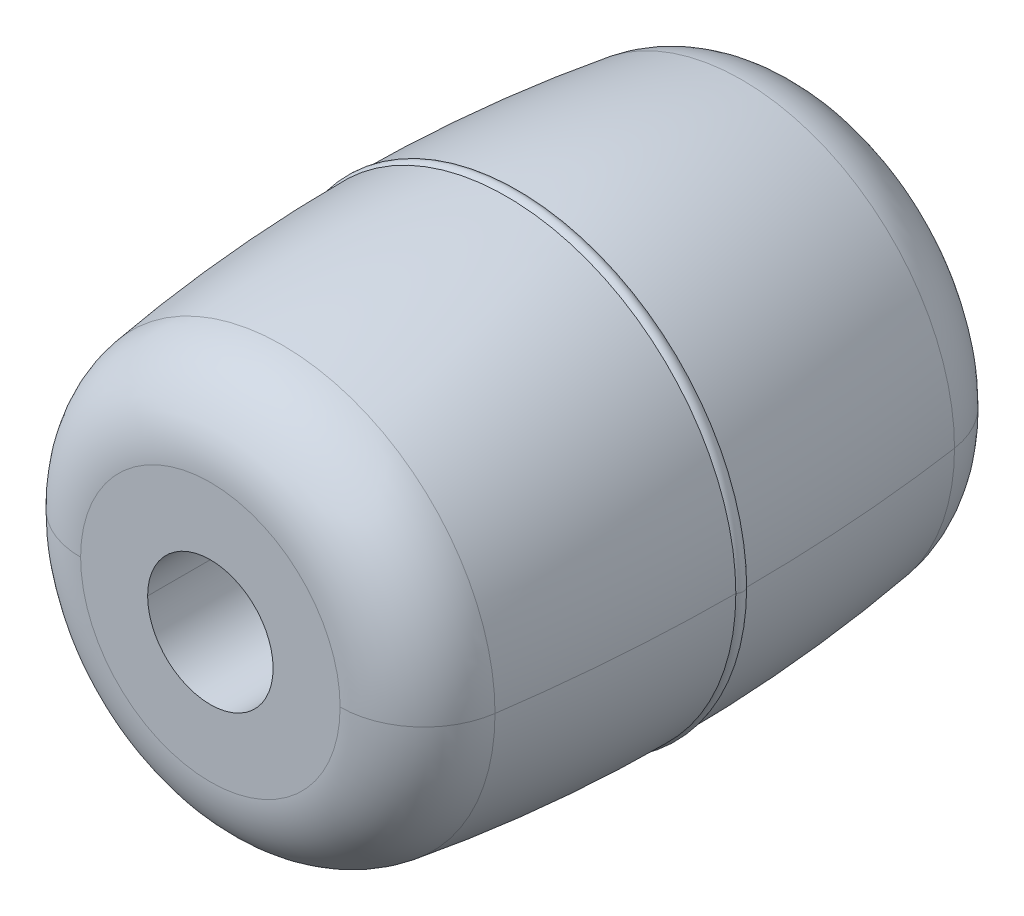
ISO-10303-21;
HEADER;
FILE_DESCRIPTION(('STEP AP214'),'2;1');
FILE_NAME('part.step','',(''),(''),'','','');
FILE_SCHEMA(('AUTOMOTIVE_DESIGN { 1 0 10303 214 1 1 1 1 }'));
ENDSEC;
DATA;
#1=APPLICATION_CONTEXT('core data for automotive mechanical design processes');
#2=APPLICATION_PROTOCOL_DEFINITION('international standard','automotive_design',2000,#1);
#3=PRODUCT_CONTEXT('',#1,'mechanical');
#4=PRODUCT('Part','Part','',(#3));
#5=PRODUCT_RELATED_PRODUCT_CATEGORY('part','',(#4));
#6=PRODUCT_DEFINITION_FORMATION('','',#4);
#7=PRODUCT_DEFINITION_CONTEXT('part definition',#1,'design');
#8=PRODUCT_DEFINITION('design','',#6,#7);
#9=PRODUCT_DEFINITION_SHAPE('','',#8);
#10=(LENGTH_UNIT() NAMED_UNIT(*) SI_UNIT(.MILLI.,.METRE.));
#11=(NAMED_UNIT(*) PLANE_ANGLE_UNIT() SI_UNIT($,.RADIAN.));
#12=(NAMED_UNIT(*) SI_UNIT($,.STERADIAN.) SOLID_ANGLE_UNIT());
#13=UNCERTAINTY_MEASURE_WITH_UNIT(LENGTH_MEASURE(1.E-05),#10,'distance_accuracy_value','');
#14=(GEOMETRIC_REPRESENTATION_CONTEXT(3) GLOBAL_UNCERTAINTY_ASSIGNED_CONTEXT((#13)) GLOBAL_UNIT_ASSIGNED_CONTEXT((#10,
#11,#12)) REPRESENTATION_CONTEXT('',''));
#15=CARTESIAN_POINT('',(0.,0.,0.));
#16=DIRECTION('',(0.,0.,1.));
#17=DIRECTION('',(1.,0.,0.));
#18=AXIS2_PLACEMENT_3D('',#15,#16,#17);
#19=CARTESIAN_POINT('',(0.,0.,0.));
#20=DIRECTION('',(0.,0.,1.));
#21=DIRECTION('',(1.,0.,0.));
#22=AXIS2_PLACEMENT_3D('',#19,#20,#21);
#23=TOROIDAL_SURFACE('',#22,7.04223679300417,0.260263206995828);
#24=CARTESIAN_POINT('',(0.,0.,-0.170686670891901));
#25=DIRECTION('',(0.,0.,-1.));
#26=DIRECTION('',(1.,0.,0.));
#27=AXIS2_PLACEMENT_3D('',#24,#25,#26);
#28=CIRCLE('',#27,7.23871324781646);
#29=CARTESIAN_POINT('',(-7.23871324781646,0.,-0.170686670891901));
#30=VERTEX_POINT('',#29);
#31=CARTESIAN_POINT('',(7.23871324781646,0.,-0.170686670891901));
#32=VERTEX_POINT('',#31);
#33=EDGE_CURVE('E122',#30,#32,#28,.T.);
#34=ORIENTED_EDGE('',*,*,#33,.F.);
#35=CARTESIAN_POINT('',(-7.04223679300417,0.,0.));
#36=DIRECTION('',(0.,1.,0.));
#37=DIRECTION('',(-1.,0.,0.));
#38=AXIS2_PLACEMENT_3D('',#35,#36,#37);
#39=CIRCLE('',#38,0.260263206995828);
#40=CARTESIAN_POINT('',(-7.23871324781646,0.,0.170686670891901));
#41=VERTEX_POINT('',#40);
#42=EDGE_CURVE('E11',#30,#41,#39,.T.);
#43=ORIENTED_EDGE('',*,*,#42,.T.);
#44=CARTESIAN_POINT('',(0.,0.,0.170686670891901));
#45=DIRECTION('',(0.,0.,1.));
#46=DIRECTION('',(-1.,0.,0.));
#47=AXIS2_PLACEMENT_3D('',#44,#45,#46);
#48=CIRCLE('',#47,7.23871324781646);
#49=CARTESIAN_POINT('',(7.23871324781646,0.,0.170686670891901));
#50=VERTEX_POINT('',#49);
#51=EDGE_CURVE('E128',#50,#41,#48,.T.);
#52=ORIENTED_EDGE('',*,*,#51,.F.);
#53=CARTESIAN_POINT('',(7.04223679300417,0.,0.));
#54=DIRECTION('',(0.,-1.,0.));
#55=DIRECTION('',(0.,0.,-1.));
#56=AXIS2_PLACEMENT_3D('',#53,#54,#55);
#57=CIRCLE('',#56,0.260263206995828);
#58=EDGE_CURVE('E138',#32,#50,#57,.T.);
#59=ORIENTED_EDGE('',*,*,#58,.F.);
#60=EDGE_LOOP('',(#34,#43,#52,#59));
#61=FACE_BOUND('',#60,.T.);
#62=ADVANCED_FACE('F16',(#61),#23,.T.);
#63=CARTESIAN_POINT('',(0.,0.,-9.525));
#64=DIRECTION('',(0.,0.,1.));
#65=DIRECTION('',(1.,0.,0.));
#66=AXIS2_PLACEMENT_3D('',#63,#64,#65);
#67=CYLINDRICAL_SURFACE('',#66,1.9812);
#68=CARTESIAN_POINT('',(0.,0.,-9.525));
#69=DIRECTION('',(0.,0.,1.));
#70=DIRECTION('',(1.,0.,0.));
#71=AXIS2_PLACEMENT_3D('',#68,#69,#70);
#72=CIRCLE('',#71,1.9812);
#73=CARTESIAN_POINT('',(-1.9812,0.,-9.525));
#74=VERTEX_POINT('',#73);
#75=CARTESIAN_POINT('',(1.9812,0.,-9.525));
#76=VERTEX_POINT('',#75);
#77=EDGE_CURVE('E114',#74,#76,#72,.T.);
#78=ORIENTED_EDGE('',*,*,#77,.F.);
#79=DIRECTION('',(0.,0.,1.));
#80=VECTOR('',#79,1.);
#81=CARTESIAN_POINT('',(-1.9812,0.,-9.525));
#82=LINE('',#81,#80);
#83=CARTESIAN_POINT('',(-1.9812,0.,9.525));
#84=VERTEX_POINT('',#83);
#85=EDGE_CURVE('E27',#74,#84,#82,.T.);
#86=ORIENTED_EDGE('',*,*,#85,.T.);
#87=CARTESIAN_POINT('',(0.,0.,9.525));
#88=DIRECTION('',(0.,0.,1.));
#89=DIRECTION('',(1.,0.,0.));
#90=AXIS2_PLACEMENT_3D('',#87,#88,#89);
#91=CIRCLE('',#90,1.9812);
#92=CARTESIAN_POINT('',(1.9812,0.,9.525));
#93=VERTEX_POINT('',#92);
#94=EDGE_CURVE('E139',#84,#93,#91,.T.);
#95=ORIENTED_EDGE('',*,*,#94,.T.);
#96=DIRECTION('',(0.,0.,1.));
#97=VECTOR('',#96,1.);
#98=CARTESIAN_POINT('',(1.9812,0.,-9.525));
#99=LINE('',#98,#97);
#100=EDGE_CURVE('E137',#76,#93,#99,.T.);
#101=ORIENTED_EDGE('',*,*,#100,.F.);
#102=EDGE_LOOP('',(#78,#86,#95,#101));
#103=FACE_BOUND('',#102,.T.);
#104=ADVANCED_FACE('F200',(#103),#67,.F.);
#105=CARTESIAN_POINT('',(0.,0.,-6.8765658098758));
#106=DIRECTION('',(0.,0.,-1.));
#107=DIRECTION('',(-1.,0.,0.));
#108=AXIS2_PLACEMENT_3D('',#105,#106,#107);
#109=TOROIDAL_SURFACE('',#108,4.09701226032457,2.6484341901242);
#110=CARTESIAN_POINT('',(0.,0.,-7.25479093496154));
#111=DIRECTION('',(0.,0.,-1.));
#112=DIRECTION('',(-1.,0.,0.));
#113=AXIS2_PLACEMENT_3D('',#110,#111,#112);
#114=CIRCLE('',#113,6.7183);
#115=CARTESIAN_POINT('',(-6.7183,0.,-7.25479093496154));
#116=VERTEX_POINT('',#115);
#117=CARTESIAN_POINT('',(6.7183,0.,-7.25479093496154));
#118=VERTEX_POINT('',#117);
#119=EDGE_CURVE('E143',#116,#118,#114,.T.);
#120=ORIENTED_EDGE('',*,*,#119,.T.);
#121=CARTESIAN_POINT('',(4.09701226032457,0.,-6.8765658098758));
#122=DIRECTION('',(0.,1.,0.));
#123=DIRECTION('',(-1.,0.,0.));
#124=AXIS2_PLACEMENT_3D('',#121,#122,#123);
#125=CIRCLE('',#124,2.6484341901242);
#126=CARTESIAN_POINT('',(4.09701226032457,0.,-9.525));
#127=VERTEX_POINT('',#126);
#128=EDGE_CURVE('E90',#118,#127,#125,.T.);
#129=ORIENTED_EDGE('',*,*,#128,.T.);
#130=CARTESIAN_POINT('',(0.,0.,-9.525));
#131=DIRECTION('',(0.,0.,-1.));
#132=DIRECTION('',(-1.,0.,0.));
#133=AXIS2_PLACEMENT_3D('',#130,#131,#132);
#134=CIRCLE('',#133,4.09701226032457);
#135=CARTESIAN_POINT('',(-4.09701226032457,0.,-9.525));
#136=VERTEX_POINT('',#135);
#137=EDGE_CURVE('E84',#136,#127,#134,.T.);
#138=ORIENTED_EDGE('',*,*,#137,.F.);
#139=CARTESIAN_POINT('',(-4.09701226032457,0.,-6.8765658098758));
#140=DIRECTION('',(0.,-1.,0.));
#141=DIRECTION('',(0.,0.,-1.));
#142=AXIS2_PLACEMENT_3D('',#139,#140,#141);
#143=CIRCLE('',#142,2.6484341901242);
#144=EDGE_CURVE('E88',#116,#136,#143,.T.);
#145=ORIENTED_EDGE('',*,*,#144,.F.);
#146=EDGE_LOOP('',(#120,#129,#138,#145));
#147=FACE_BOUND('',#146,.T.);
#148=ADVANCED_FACE('F87',(#147),#109,.T.);
#149=CARTESIAN_POINT('',(0.,0.,0.));
#150=DIRECTION('',(0.,0.,-1.));
#151=DIRECTION('',(1.,0.,0.));
#152=AXIS2_PLACEMENT_3D('',#149,#150,#151);
#153=DEGENERATE_TOROIDAL_SURFACE('',#152,43.561,50.8,.F.);
#154=ORIENTED_EDGE('',*,*,#33,.T.);
#155=CARTESIAN_POINT('',(-43.561,0.,0.));
#156=DIRECTION('',(0.,1.,0.));
#157=DIRECTION('',(-1.,0.,0.));
#158=AXIS2_PLACEMENT_3D('',#155,#156,#157);
#159=CIRCLE('',#158,50.8);
#160=EDGE_CURVE('E120',#32,#118,#159,.T.);
#161=ORIENTED_EDGE('',*,*,#160,.T.);
#162=ORIENTED_EDGE('',*,*,#119,.F.);
#163=CARTESIAN_POINT('',(43.561,0.,0.));
#164=DIRECTION('',(0.,-1.,0.));
#165=DIRECTION('',(0.,0.,-1.));
#166=AXIS2_PLACEMENT_3D('',#163,#164,#165);
#167=CIRCLE('',#166,50.8);
#168=EDGE_CURVE('E42',#30,#116,#167,.T.);
#169=ORIENTED_EDGE('',*,*,#168,.F.);
#170=EDGE_LOOP('',(#154,#161,#162,#169));
#171=FACE_BOUND('',#170,.T.);
#172=ADVANCED_FACE('F226',(#171),#153,.F.);
#173=CARTESIAN_POINT('',(0.,0.,6.8765658098758));
#174=DIRECTION('',(0.,0.,-1.));
#175=DIRECTION('',(-1.,0.,0.));
#176=AXIS2_PLACEMENT_3D('',#173,#174,#175);
#177=TOROIDAL_SURFACE('',#176,4.09701226032457,2.6484341901242);
#178=CARTESIAN_POINT('',(0.,0.,9.525));
#179=DIRECTION('',(0.,0.,-1.));
#180=DIRECTION('',(-1.,0.,0.));
#181=AXIS2_PLACEMENT_3D('',#178,#179,#180);
#182=CIRCLE('',#181,4.09701226032457);
#183=CARTESIAN_POINT('',(-4.09701226032457,0.,9.525));
#184=VERTEX_POINT('',#183);
#185=CARTESIAN_POINT('',(4.09701226032457,0.,9.525));
#186=VERTEX_POINT('',#185);
#187=EDGE_CURVE('E118',#184,#186,#182,.T.);
#188=ORIENTED_EDGE('',*,*,#187,.T.);
#189=CARTESIAN_POINT('',(4.09701226032457,0.,6.8765658098758));
#190=DIRECTION('',(0.,1.,0.));
#191=DIRECTION('',(-1.,0.,0.));
#192=AXIS2_PLACEMENT_3D('',#189,#190,#191);
#193=CIRCLE('',#192,2.6484341901242);
#194=CARTESIAN_POINT('',(6.7183,0.,7.25479093496154));
#195=VERTEX_POINT('',#194);
#196=EDGE_CURVE('E158',#186,#195,#193,.T.);
#197=ORIENTED_EDGE('',*,*,#196,.T.);
#198=CARTESIAN_POINT('',(0.,0.,7.25479093496154));
#199=DIRECTION('',(0.,0.,-1.));
#200=DIRECTION('',(-1.,0.,0.));
#201=AXIS2_PLACEMENT_3D('',#198,#199,#200);
#202=CIRCLE('',#201,6.7183);
#203=CARTESIAN_POINT('',(-6.7183,0.,7.25479093496154));
#204=VERTEX_POINT('',#203);
#205=EDGE_CURVE('E154',#204,#195,#202,.T.);
#206=ORIENTED_EDGE('',*,*,#205,.F.);
#207=CARTESIAN_POINT('',(-4.09701226032457,0.,6.8765658098758));
#208=DIRECTION('',(0.,-1.,0.));
#209=DIRECTION('',(0.,0.,-1.));
#210=AXIS2_PLACEMENT_3D('',#207,#208,#209);
#211=CIRCLE('',#210,2.6484341901242);
#212=EDGE_CURVE('E147',#184,#204,#211,.T.);
#213=ORIENTED_EDGE('',*,*,#212,.F.);
#214=EDGE_LOOP('',(#188,#197,#206,#213));
#215=FACE_BOUND('',#214,.T.);
#216=ADVANCED_FACE('F225',(#215),#177,.T.);
#217=CARTESIAN_POINT('',(0.,0.,0.));
#218=DIRECTION('',(0.,0.,-1.));
#219=DIRECTION('',(1.,0.,0.));
#220=AXIS2_PLACEMENT_3D('',#217,#218,#219);
#221=DEGENERATE_TOROIDAL_SURFACE('',#220,43.561,50.8,.F.);
#222=ORIENTED_EDGE('',*,*,#205,.T.);
#223=CARTESIAN_POINT('',(-43.561,0.,0.));
#224=DIRECTION('',(0.,1.,0.));
#225=DIRECTION('',(-1.,0.,0.));
#226=AXIS2_PLACEMENT_3D('',#223,#224,#225);
#227=CIRCLE('',#226,50.8);
#228=EDGE_CURVE('E131',#195,#50,#227,.T.);
#229=ORIENTED_EDGE('',*,*,#228,.T.);
#230=ORIENTED_EDGE('',*,*,#51,.T.);
#231=CARTESIAN_POINT('',(43.561,0.,0.));
#232=DIRECTION('',(0.,-1.,0.));
#233=DIRECTION('',(0.,0.,-1.));
#234=AXIS2_PLACEMENT_3D('',#231,#232,#233);
#235=CIRCLE('',#234,50.8);
#236=EDGE_CURVE('E123',#204,#41,#235,.T.);
#237=ORIENTED_EDGE('',*,*,#236,.F.);
#238=EDGE_LOOP('',(#222,#229,#230,#237));
#239=FACE_BOUND('',#238,.T.);
#240=ADVANCED_FACE('F265',(#239),#221,.F.);
#241=CARTESIAN_POINT('',(0.,0.,0.));
#242=DIRECTION('',(0.,0.,-1.));
#243=DIRECTION('',(1.,0.,0.));
#244=AXIS2_PLACEMENT_3D('',#241,#242,#243);
#245=DEGENERATE_TOROIDAL_SURFACE('',#244,43.561,50.8,.F.);
#246=ORIENTED_EDGE('',*,*,#228,.F.);
#247=CARTESIAN_POINT('',(0.,0.,7.25479093496154));
#248=DIRECTION('',(0.,0.,-1.));
#249=DIRECTION('',(-1.,0.,0.));
#250=AXIS2_PLACEMENT_3D('',#247,#248,#249);
#251=CIRCLE('',#250,6.7183);
#252=EDGE_CURVE('E125',#195,#204,#251,.T.);
#253=ORIENTED_EDGE('',*,*,#252,.T.);
#254=ORIENTED_EDGE('',*,*,#236,.T.);
#255=CARTESIAN_POINT('',(0.,0.,0.170686670891901));
#256=DIRECTION('',(0.,0.,1.));
#257=DIRECTION('',(-1.,0.,0.));
#258=AXIS2_PLACEMENT_3D('',#255,#256,#257);
#259=CIRCLE('',#258,7.23871324781646);
#260=EDGE_CURVE('E126',#41,#50,#259,.T.);
#261=ORIENTED_EDGE('',*,*,#260,.T.);
#262=EDGE_LOOP('',(#246,#253,#254,#261));
#263=FACE_BOUND('',#262,.T.);
#264=ADVANCED_FACE('F268',(#263),#245,.F.);
#265=CARTESIAN_POINT('',(0.,0.,6.8765658098758));
#266=DIRECTION('',(0.,0.,-1.));
#267=DIRECTION('',(-1.,0.,0.));
#268=AXIS2_PLACEMENT_3D('',#265,#266,#267);
#269=TOROIDAL_SURFACE('',#268,4.09701226032457,2.6484341901242);
#270=ORIENTED_EDGE('',*,*,#196,.F.);
#271=CARTESIAN_POINT('',(0.,0.,9.525));
#272=DIRECTION('',(0.,0.,-1.));
#273=DIRECTION('',(-1.,0.,0.));
#274=AXIS2_PLACEMENT_3D('',#271,#272,#273);
#275=CIRCLE('',#274,4.09701226032457);
#276=EDGE_CURVE('E151',#186,#184,#275,.T.);
#277=ORIENTED_EDGE('',*,*,#276,.T.);
#278=ORIENTED_EDGE('',*,*,#212,.T.);
#279=ORIENTED_EDGE('',*,*,#252,.F.);
#280=EDGE_LOOP('',(#270,#277,#278,#279));
#281=FACE_BOUND('',#280,.T.);
#282=ADVANCED_FACE('F278',(#281),#269,.T.);
#283=CARTESIAN_POINT('',(0.,0.,0.));
#284=DIRECTION('',(0.,0.,-1.));
#285=DIRECTION('',(1.,0.,0.));
#286=AXIS2_PLACEMENT_3D('',#283,#284,#285);
#287=DEGENERATE_TOROIDAL_SURFACE('',#286,43.561,50.8,.F.);
#288=ORIENTED_EDGE('',*,*,#160,.F.);
#289=CARTESIAN_POINT('',(0.,0.,-0.170686670891901));
#290=DIRECTION('',(0.,0.,-1.));
#291=DIRECTION('',(1.,0.,0.));
#292=AXIS2_PLACEMENT_3D('',#289,#290,#291);
#293=CIRCLE('',#292,7.23871324781646);
#294=EDGE_CURVE('E20',#32,#30,#293,.T.);
#295=ORIENTED_EDGE('',*,*,#294,.T.);
#296=ORIENTED_EDGE('',*,*,#168,.T.);
#297=CARTESIAN_POINT('',(0.,0.,-7.25479093496154));
#298=DIRECTION('',(0.,0.,-1.));
#299=DIRECTION('',(-1.,0.,0.));
#300=AXIS2_PLACEMENT_3D('',#297,#298,#299);
#301=CIRCLE('',#300,6.7183);
#302=EDGE_CURVE('E101',#118,#116,#301,.T.);
#303=ORIENTED_EDGE('',*,*,#302,.F.);
#304=EDGE_LOOP('',(#288,#295,#296,#303));
#305=FACE_BOUND('',#304,.T.);
#306=ADVANCED_FACE('F239',(#305),#287,.F.);
#307=CARTESIAN_POINT('',(0.,0.,-6.8765658098758));
#308=DIRECTION('',(0.,0.,-1.));
#309=DIRECTION('',(-1.,0.,0.));
#310=AXIS2_PLACEMENT_3D('',#307,#308,#309);
#311=TOROIDAL_SURFACE('',#310,4.09701226032457,2.6484341901242);
#312=ORIENTED_EDGE('',*,*,#128,.F.);
#313=ORIENTED_EDGE('',*,*,#302,.T.);
#314=ORIENTED_EDGE('',*,*,#144,.T.);
#315=CARTESIAN_POINT('',(0.,0.,-9.525));
#316=DIRECTION('',(0.,0.,-1.));
#317=DIRECTION('',(-1.,0.,0.));
#318=AXIS2_PLACEMENT_3D('',#315,#316,#317);
#319=CIRCLE('',#318,4.09701226032457);
#320=EDGE_CURVE('E95',#127,#136,#319,.T.);
#321=ORIENTED_EDGE('',*,*,#320,.F.);
#322=EDGE_LOOP('',(#312,#313,#314,#321));
#323=FACE_BOUND('',#322,.T.);
#324=ADVANCED_FACE('F99',(#323),#311,.T.);
#325=CARTESIAN_POINT('',(0.,0.,-9.525));
#326=DIRECTION('',(0.,0.,1.));
#327=DIRECTION('',(1.,0.,0.));
#328=AXIS2_PLACEMENT_3D('',#325,#326,#327);
#329=PLANE('',#328);
#330=ORIENTED_EDGE('',*,*,#137,.T.);
#331=ORIENTED_EDGE('',*,*,#320,.T.);
#332=EDGE_LOOP('',(#330,#331));
#333=FACE_BOUND('',#332,.T.);
#334=CARTESIAN_POINT('',(0.,0.,-9.525));
#335=DIRECTION('',(0.,0.,1.));
#336=DIRECTION('',(1.,0.,0.));
#337=AXIS2_PLACEMENT_3D('',#334,#335,#336);
#338=CIRCLE('',#337,1.9812);
#339=EDGE_CURVE('E106',#76,#74,#338,.T.);
#340=ORIENTED_EDGE('',*,*,#339,.T.);
#341=ORIENTED_EDGE('',*,*,#77,.T.);
#342=EDGE_LOOP('',(#340,#341));
#343=FACE_BOUND('',#342,.T.);
#344=ADVANCED_FACE('F18',(#333,#343),#329,.F.);
#345=CARTESIAN_POINT('',(0.,0.,9.525));
#346=DIRECTION('',(0.,0.,-1.));
#347=DIRECTION('',(0.,-1.,0.));
#348=AXIS2_PLACEMENT_3D('',#345,#346,#347);
#349=PLANE('',#348);
#350=ORIENTED_EDGE('',*,*,#187,.F.);
#351=ORIENTED_EDGE('',*,*,#276,.F.);
#352=EDGE_LOOP('',(#350,#351));
#353=FACE_BOUND('',#352,.T.);
#354=CARTESIAN_POINT('',(0.,0.,9.525));
#355=DIRECTION('',(0.,0.,1.));
#356=DIRECTION('',(1.,0.,0.));
#357=AXIS2_PLACEMENT_3D('',#354,#355,#356);
#358=CIRCLE('',#357,1.9812);
#359=EDGE_CURVE('E133',#93,#84,#358,.T.);
#360=ORIENTED_EDGE('',*,*,#359,.F.);
#361=ORIENTED_EDGE('',*,*,#94,.F.);
#362=EDGE_LOOP('',(#360,#361));
#363=FACE_BOUND('',#362,.T.);
#364=ADVANCED_FACE('F202',(#353,#363),#349,.F.);
#365=CARTESIAN_POINT('',(0.,0.,-9.525));
#366=DIRECTION('',(0.,0.,1.));
#367=DIRECTION('',(1.,0.,0.));
#368=AXIS2_PLACEMENT_3D('',#365,#366,#367);
#369=CYLINDRICAL_SURFACE('',#368,1.9812);
#370=ORIENTED_EDGE('',*,*,#85,.F.);
#371=ORIENTED_EDGE('',*,*,#339,.F.);
#372=ORIENTED_EDGE('',*,*,#100,.T.);
#373=ORIENTED_EDGE('',*,*,#359,.T.);
#374=EDGE_LOOP('',(#370,#371,#372,#373));
#375=FACE_BOUND('',#374,.T.);
#376=ADVANCED_FACE('F195',(#375),#369,.F.);
#377=CARTESIAN_POINT('',(0.,0.,0.));
#378=DIRECTION('',(0.,0.,1.));
#379=DIRECTION('',(1.,0.,0.));
#380=AXIS2_PLACEMENT_3D('',#377,#378,#379);
#381=TOROIDAL_SURFACE('',#380,7.04223679300417,0.260263206995828);
#382=ORIENTED_EDGE('',*,*,#42,.F.);
#383=ORIENTED_EDGE('',*,*,#294,.F.);
#384=ORIENTED_EDGE('',*,*,#58,.T.);
#385=ORIENTED_EDGE('',*,*,#260,.F.);
#386=EDGE_LOOP('',(#382,#383,#384,#385));
#387=FACE_BOUND('',#386,.T.);
#388=ADVANCED_FACE('F211',(#387),#381,.T.);
#389=CLOSED_SHELL('',(#62,#104,#148,#172,#216,#240,#264,#282,#306,#324,#344,#364,#376,#388));
#390=MANIFOLD_SOLID_BREP('B1',#389);
#391=ADVANCED_BREP_SHAPE_REPRESENTATION('',(#18,#390),#14);
#392=SHAPE_DEFINITION_REPRESENTATION(#9,#391);
ENDSEC;
END-ISO-10303-21;
